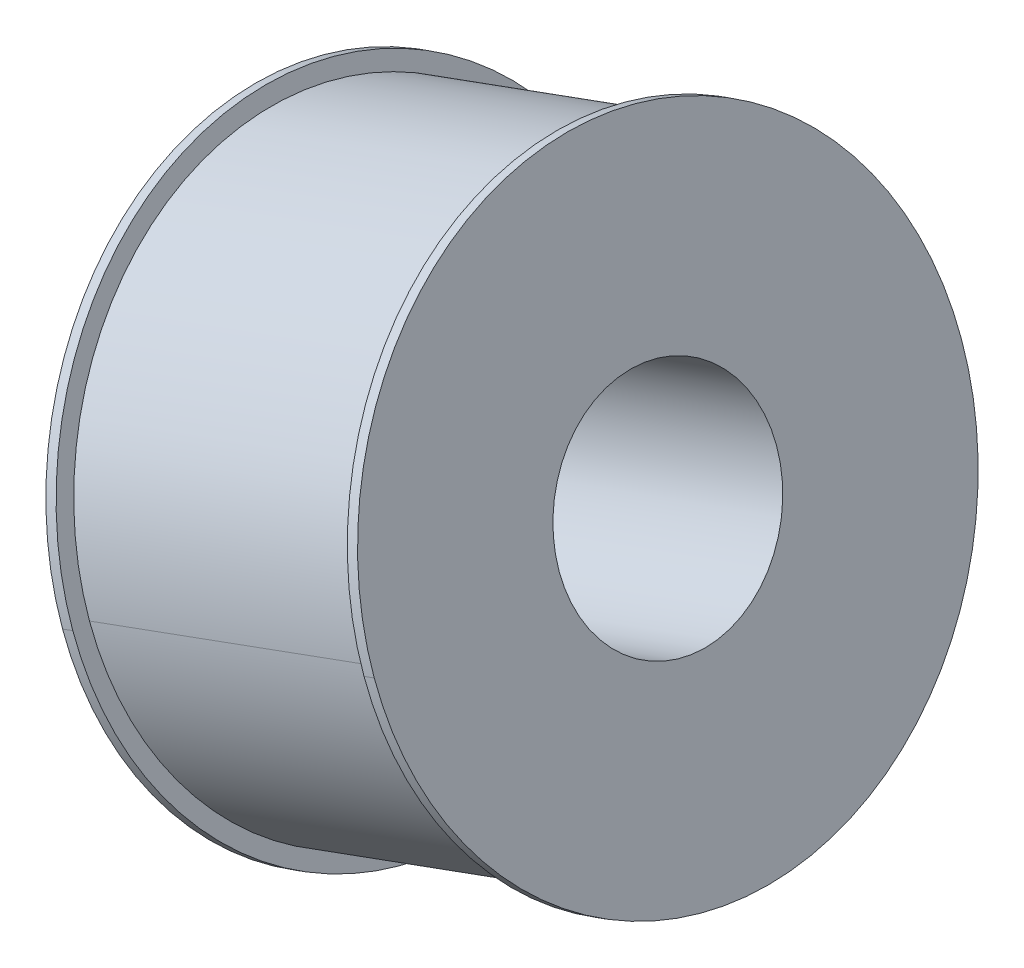
ISO-10303-21;
HEADER;
FILE_DESCRIPTION(('STEP AP214'),'2;1');
FILE_NAME('part.step','',(''),(''),'','','');
FILE_SCHEMA(('AUTOMOTIVE_DESIGN { 1 0 10303 214 1 1 1 1 }'));
ENDSEC;
DATA;
#1=APPLICATION_CONTEXT('core data for automotive mechanical design processes');
#2=APPLICATION_PROTOCOL_DEFINITION('international standard','automotive_design',2000,#1);
#3=PRODUCT_CONTEXT('',#1,'mechanical');
#4=PRODUCT('Part','Part','',(#3));
#5=PRODUCT_RELATED_PRODUCT_CATEGORY('part','',(#4));
#6=PRODUCT_DEFINITION_FORMATION('','',#4);
#7=PRODUCT_DEFINITION_CONTEXT('part definition',#1,'design');
#8=PRODUCT_DEFINITION('design','',#6,#7);
#9=PRODUCT_DEFINITION_SHAPE('','',#8);
#10=(LENGTH_UNIT() NAMED_UNIT(*) SI_UNIT(.MILLI.,.METRE.));
#11=(NAMED_UNIT(*) PLANE_ANGLE_UNIT() SI_UNIT($,.RADIAN.));
#12=(NAMED_UNIT(*) SI_UNIT($,.STERADIAN.) SOLID_ANGLE_UNIT());
#13=UNCERTAINTY_MEASURE_WITH_UNIT(LENGTH_MEASURE(1.E-05),#10,'distance_accuracy_value','');
#14=(GEOMETRIC_REPRESENTATION_CONTEXT(3) GLOBAL_UNCERTAINTY_ASSIGNED_CONTEXT((#13)) GLOBAL_UNIT_ASSIGNED_CONTEXT((#10,
#11,#12)) REPRESENTATION_CONTEXT('',''));
#15=CARTESIAN_POINT('',(0.,0.,0.));
#16=DIRECTION('',(0.,0.,1.));
#17=DIRECTION('',(1.,0.,0.));
#18=AXIS2_PLACEMENT_3D('',#15,#16,#17);
#19=CARTESIAN_POINT('',(53.8252917617742,-3.46148737991286,406.59864258433));
#20=DIRECTION('',(-0.93969262078591,-0.342020143325663,0.));
#21=DIRECTION('',(0.,0.,-1.));
#22=AXIS2_PLACEMENT_3D('',#19,#20,#21);
#23=CYLINDRICAL_SURFACE('',#22,27.);
#24=CARTESIAN_POINT('',(53.8252917617742,-3.46148737991286,406.59864258433));
#25=DIRECTION('',(-0.93969262078591,-0.342020143325663,0.));
#26=DIRECTION('',(0.,0.,-1.));
#27=AXIS2_PLACEMENT_3D('',#24,#25,#26);
#28=CIRCLE('',#27,27.);
#29=CARTESIAN_POINT('',(53.8252917617742,-3.46148737991286,379.59864258433));
#30=VERTEX_POINT('',#29);
#31=CARTESIAN_POINT('',(53.8252917617742,-3.46148737991287,433.59864258433));
#32=VERTEX_POINT('',#31);
#33=EDGE_CURVE('E11',#30,#32,#28,.T.);
#34=ORIENTED_EDGE('',*,*,#33,.T.);
#35=DIRECTION('',(-0.93969262078591,-0.342020143325663,0.));
#36=VECTOR('',#35,1.);
#37=CARTESIAN_POINT('',(53.8252917617742,-3.46148737991287,433.59864258433));
#38=LINE('',#37,#36);
#39=CARTESIAN_POINT('',(52.8855991409883,-3.80350752323853,433.59864258433));
#40=VERTEX_POINT('',#39);
#41=EDGE_CURVE('E60',#32,#40,#38,.T.);
#42=ORIENTED_EDGE('',*,*,#41,.T.);
#43=CARTESIAN_POINT('',(52.8855991409883,-3.80350752323853,406.59864258433));
#44=DIRECTION('',(-0.93969262078591,-0.342020143325663,0.));
#45=DIRECTION('',(0.,0.,-1.));
#46=AXIS2_PLACEMENT_3D('',#43,#44,#45);
#47=CIRCLE('',#46,27.);
#48=CARTESIAN_POINT('',(52.8855991409883,-3.80350752323853,379.59864258433));
#49=VERTEX_POINT('',#48);
#50=EDGE_CURVE('E174',#49,#40,#47,.T.);
#51=ORIENTED_EDGE('',*,*,#50,.F.);
#52=DIRECTION('',(-0.93969262078591,-0.342020143325663,0.));
#53=VECTOR('',#52,1.);
#54=CARTESIAN_POINT('',(53.8252917617742,-3.46148737991286,379.59864258433));
#55=LINE('',#54,#53);
#56=EDGE_CURVE('E132',#30,#49,#55,.T.);
#57=ORIENTED_EDGE('',*,*,#56,.F.);
#58=EDGE_LOOP('',(#34,#42,#51,#57));
#59=FACE_BOUND('',#58,.T.);
#60=ADVANCED_FACE('F49',(#59),#23,.T.);
#61=CARTESIAN_POINT('',(80.6065314541727,6.28608670486854,406.59864258433));
#62=DIRECTION('',(0.93969262078591,0.342020143325663,0.));
#63=DIRECTION('',(0.,0.,1.));
#64=AXIS2_PLACEMENT_3D('',#61,#62,#63);
#65=CYLINDRICAL_SURFACE('',#64,27.);
#66=CARTESIAN_POINT('',(80.6065314541727,6.28608670486854,406.59864258433));
#67=DIRECTION('',(0.93969262078591,0.342020143325663,0.));
#68=DIRECTION('',(0.,0.,1.));
#69=AXIS2_PLACEMENT_3D('',#66,#67,#68);
#70=CIRCLE('',#69,27.);
#71=CARTESIAN_POINT('',(80.6065314541727,6.28608670486854,433.59864258433));
#72=VERTEX_POINT('',#71);
#73=CARTESIAN_POINT('',(80.6065314541727,6.28608670486853,379.59864258433));
#74=VERTEX_POINT('',#73);
#75=EDGE_CURVE('E167',#72,#74,#70,.T.);
#76=ORIENTED_EDGE('',*,*,#75,.T.);
#77=DIRECTION('',(0.93969262078591,0.342020143325663,0.));
#78=VECTOR('',#77,1.);
#79=CARTESIAN_POINT('',(80.6065314541727,6.28608670486853,379.59864258433));
#80=LINE('',#79,#78);
#81=CARTESIAN_POINT('',(81.5462240749586,6.6281068481942,379.59864258433));
#82=VERTEX_POINT('',#81);
#83=EDGE_CURVE('E163',#74,#82,#80,.T.);
#84=ORIENTED_EDGE('',*,*,#83,.T.);
#85=CARTESIAN_POINT('',(81.5462240749586,6.6281068481942,406.59864258433));
#86=DIRECTION('',(0.93969262078591,0.342020143325663,0.));
#87=DIRECTION('',(0.,0.,1.));
#88=AXIS2_PLACEMENT_3D('',#85,#86,#87);
#89=CIRCLE('',#88,27.);
#90=CARTESIAN_POINT('',(81.5462240749586,6.6281068481942,433.59864258433));
#91=VERTEX_POINT('',#90);
#92=EDGE_CURVE('E160',#91,#82,#89,.T.);
#93=ORIENTED_EDGE('',*,*,#92,.F.);
#94=DIRECTION('',(0.93969262078591,0.342020143325663,0.));
#95=VECTOR('',#94,1.);
#96=CARTESIAN_POINT('',(80.6065314541727,6.28608670486854,433.59864258433));
#97=LINE('',#96,#95);
#98=EDGE_CURVE('E195',#72,#91,#97,.T.);
#99=ORIENTED_EDGE('',*,*,#98,.F.);
#100=EDGE_LOOP('',(#76,#84,#93,#99));
#101=FACE_BOUND('',#100,.T.);
#102=ADVANCED_FACE('F213',(#101),#65,.T.);
#103=CARTESIAN_POINT('',(52.8855991409883,-3.80350752323853,406.59864258433));
#104=DIRECTION('',(-0.93969262078591,-0.342020143325663,0.));
#105=DIRECTION('',(0.,0.,-1.));
#106=AXIS2_PLACEMENT_3D('',#103,#104,#105);
#107=CYLINDRICAL_SURFACE('',#106,19.);
#108=CARTESIAN_POINT('',(52.8855991409883,-3.80350752323853,406.59864258433));
#109=DIRECTION('',(0.93969262078591,0.342020143325663,0.));
#110=DIRECTION('',(0.,0.,1.));
#111=AXIS2_PLACEMENT_3D('',#108,#109,#110);
#112=CIRCLE('',#111,19.);
#113=CARTESIAN_POINT('',(52.8855991409883,-3.80350752323853,425.59864258433));
#114=VERTEX_POINT('',#113);
#115=CARTESIAN_POINT('',(52.8855991409883,-3.80350752323853,387.59864258433));
#116=VERTEX_POINT('',#115);
#117=EDGE_CURVE('E189',#114,#116,#112,.T.);
#118=ORIENTED_EDGE('',*,*,#117,.F.);
#119=DIRECTION('',(-0.93969262078591,-0.342020143325663,0.));
#120=VECTOR('',#119,1.);
#121=CARTESIAN_POINT('',(52.8855991409883,-3.80350752323853,425.59864258433));
#122=LINE('',#121,#120);
#123=CARTESIAN_POINT('',(45.837904485094,-6.368658598181,425.59864258433));
#124=VERTEX_POINT('',#123);
#125=EDGE_CURVE('E168',#114,#124,#122,.T.);
#126=ORIENTED_EDGE('',*,*,#125,.T.);
#127=CARTESIAN_POINT('',(45.837904485094,-6.368658598181,406.59864258433));
#128=DIRECTION('',(0.93969262078591,0.342020143325663,0.));
#129=DIRECTION('',(0.,0.,1.));
#130=AXIS2_PLACEMENT_3D('',#127,#128,#129);
#131=CIRCLE('',#130,19.);
#132=CARTESIAN_POINT('',(45.837904485094,-6.368658598181,387.59864258433));
#133=VERTEX_POINT('',#132);
#134=EDGE_CURVE('E373',#124,#133,#131,.T.);
#135=ORIENTED_EDGE('',*,*,#134,.T.);
#136=DIRECTION('',(-0.93969262078591,-0.342020143325663,0.));
#137=VECTOR('',#136,1.);
#138=CARTESIAN_POINT('',(52.8855991409883,-3.80350752323853,387.59864258433));
#139=LINE('',#138,#137);
#140=EDGE_CURVE('E140',#116,#133,#139,.T.);
#141=ORIENTED_EDGE('',*,*,#140,.F.);
#142=EDGE_LOOP('',(#118,#126,#135,#141));
#143=FACE_BOUND('',#142,.T.);
#144=ADVANCED_FACE('F239',(#143),#107,.T.);
#145=CARTESIAN_POINT('',(81.5462240749586,6.6281068481942,406.59864258433));
#146=DIRECTION('',(-0.93969262078591,-0.342020143325663,0.));
#147=DIRECTION('',(0.,0.,-1.));
#148=AXIS2_PLACEMENT_3D('',#145,#146,#147);
#149=CYLINDRICAL_SURFACE('',#148,25.465);
#150=CARTESIAN_POINT('',(80.6065314541727,6.28608670486854,406.59864258433));
#151=DIRECTION('',(0.93969262078591,0.342020143325663,0.));
#152=DIRECTION('',(0.,0.,1.));
#153=AXIS2_PLACEMENT_3D('',#150,#151,#152);
#154=CIRCLE('',#153,25.465);
#155=CARTESIAN_POINT('',(80.6065314541727,6.28608670486853,432.06364258433));
#156=VERTEX_POINT('',#155);
#157=CARTESIAN_POINT('',(80.6065314541727,6.28608670486854,381.13364258433));
#158=VERTEX_POINT('',#157);
#159=EDGE_CURVE('E152',#156,#158,#154,.T.);
#160=ORIENTED_EDGE('',*,*,#159,.F.);
#161=DIRECTION('',(-0.93969262078591,-0.342020143325663,0.));
#162=VECTOR('',#161,1.);
#163=CARTESIAN_POINT('',(81.5462240749586,6.6281068481942,432.06364258433));
#164=LINE('',#163,#162);
#165=CARTESIAN_POINT('',(53.8252917617742,-3.46148737991287,432.06364258433));
#166=VERTEX_POINT('',#165);
#167=EDGE_CURVE('E127',#156,#166,#164,.T.);
#168=ORIENTED_EDGE('',*,*,#167,.T.);
#169=CARTESIAN_POINT('',(53.8252917617742,-3.46148737991286,406.59864258433));
#170=DIRECTION('',(-0.93969262078591,-0.342020143325663,0.));
#171=DIRECTION('',(0.,0.,-1.));
#172=AXIS2_PLACEMENT_3D('',#169,#170,#171);
#173=CIRCLE('',#172,25.465);
#174=CARTESIAN_POINT('',(53.8252917617742,-3.46148737991286,381.13364258433));
#175=VERTEX_POINT('',#174);
#176=EDGE_CURVE('E120',#175,#166,#173,.T.);
#177=ORIENTED_EDGE('',*,*,#176,.F.);
#178=DIRECTION('',(-0.93969262078591,-0.342020143325663,0.));
#179=VECTOR('',#178,1.);
#180=CARTESIAN_POINT('',(81.5462240749586,6.6281068481942,381.13364258433));
#181=LINE('',#180,#179);
#182=EDGE_CURVE('E124',#158,#175,#181,.T.);
#183=ORIENTED_EDGE('',*,*,#182,.F.);
#184=EDGE_LOOP('',(#160,#168,#177,#183));
#185=FACE_BOUND('',#184,.T.);
#186=ADVANCED_FACE('F123',(#185),#149,.T.);
#187=CARTESIAN_POINT('',(81.5462240749586,6.6281068481942,406.59864258433));
#188=DIRECTION('',(-0.93969262078591,-0.342020143325663,0.));
#189=DIRECTION('',(0.,0.,-1.));
#190=AXIS2_PLACEMENT_3D('',#187,#188,#189);
#191=CYLINDRICAL_SURFACE('',#190,25.465);
#192=ORIENTED_EDGE('',*,*,#167,.F.);
#193=CARTESIAN_POINT('',(80.6065314541727,6.28608670486854,406.59864258433));
#194=DIRECTION('',(0.93969262078591,0.342020143325663,0.));
#195=DIRECTION('',(0.,0.,1.));
#196=AXIS2_PLACEMENT_3D('',#193,#194,#195);
#197=CIRCLE('',#196,25.465);
#198=EDGE_CURVE('E138',#158,#156,#197,.T.);
#199=ORIENTED_EDGE('',*,*,#198,.F.);
#200=ORIENTED_EDGE('',*,*,#182,.T.);
#201=CARTESIAN_POINT('',(53.8252917617742,-3.46148737991286,406.59864258433));
#202=DIRECTION('',(-0.93969262078591,-0.342020143325663,0.));
#203=DIRECTION('',(0.,0.,-1.));
#204=AXIS2_PLACEMENT_3D('',#201,#202,#203);
#205=CIRCLE('',#204,25.465);
#206=EDGE_CURVE('E133',#166,#175,#205,.T.);
#207=ORIENTED_EDGE('',*,*,#206,.F.);
#208=EDGE_LOOP('',(#192,#199,#200,#207));
#209=FACE_BOUND('',#208,.T.);
#210=ADVANCED_FACE('F136',(#209),#191,.T.);
#211=CARTESIAN_POINT('',(45.837904485094,-6.368658598181,406.59864258433));
#212=DIRECTION('',(0.93969262078591,0.342020143325663,0.));
#213=DIRECTION('',(0.342020143325663,-0.93969262078591,0.));
#214=AXIS2_PLACEMENT_3D('',#211,#212,#213);
#215=PLANE('',#214);
#216=CARTESIAN_POINT('',(45.837904485094,-6.368658598181,406.59864258433));
#217=DIRECTION('',(0.93969262078591,0.342020143325663,0.));
#218=DIRECTION('',(0.,0.,1.));
#219=AXIS2_PLACEMENT_3D('',#216,#217,#218);
#220=CIRCLE('',#219,19.);
#221=EDGE_CURVE('E156',#133,#124,#220,.T.);
#222=ORIENTED_EDGE('',*,*,#221,.F.);
#223=ORIENTED_EDGE('',*,*,#134,.F.);
#224=EDGE_LOOP('',(#222,#223));
#225=FACE_BOUND('',#224,.T.);
#226=CARTESIAN_POINT('',(45.837904485094,-6.368658598181,406.59864258433));
#227=DIRECTION('',(-0.93969262078591,-0.342020143325663,0.));
#228=DIRECTION('',(0.342020143325663,-0.93969262078591,0.));
#229=AXIS2_PLACEMENT_3D('',#226,#227,#228);
#230=CIRCLE('',#229,9.99999999999998);
#231=CARTESIAN_POINT('',(49.2581059183506,-15.7655848060401,406.59864258433));
#232=VERTEX_POINT('',#231);
#233=EDGE_CURVE('E148',#232,#232,#230,.T.);
#234=ORIENTED_EDGE('',*,*,#233,.F.);
#235=EDGE_LOOP('',(#234));
#236=FACE_BOUND('',#235,.T.);
#237=ADVANCED_FACE('F244',(#225,#236),#215,.F.);
#238=CARTESIAN_POINT('',(52.8855991409883,-3.80350752323853,406.59864258433));
#239=DIRECTION('',(-0.93969262078591,-0.342020143325663,0.));
#240=DIRECTION('',(0.,0.,-1.));
#241=AXIS2_PLACEMENT_3D('',#238,#239,#240);
#242=CYLINDRICAL_SURFACE('',#241,19.);
#243=ORIENTED_EDGE('',*,*,#125,.F.);
#244=CARTESIAN_POINT('',(52.8855991409883,-3.80350752323853,406.59864258433));
#245=DIRECTION('',(0.93969262078591,0.342020143325663,0.));
#246=DIRECTION('',(0.,0.,1.));
#247=AXIS2_PLACEMENT_3D('',#244,#245,#246);
#248=CIRCLE('',#247,19.);
#249=EDGE_CURVE('E53',#116,#114,#248,.T.);
#250=ORIENTED_EDGE('',*,*,#249,.F.);
#251=ORIENTED_EDGE('',*,*,#140,.T.);
#252=ORIENTED_EDGE('',*,*,#221,.T.);
#253=EDGE_LOOP('',(#243,#250,#251,#252));
#254=FACE_BOUND('',#253,.T.);
#255=ADVANCED_FACE('F219',(#254),#242,.T.);
#256=CARTESIAN_POINT('',(81.5462240749586,6.6281068481942,406.59864258433));
#257=DIRECTION('',(0.93969262078591,0.342020143325663,0.));
#258=DIRECTION('',(0.342020143325663,-0.93969262078591,0.));
#259=AXIS2_PLACEMENT_3D('',#256,#257,#258);
#260=PLANE('',#259);
#261=ORIENTED_EDGE('',*,*,#92,.T.);
#262=CARTESIAN_POINT('',(81.5462240749586,6.6281068481942,406.59864258433));
#263=DIRECTION('',(0.93969262078591,0.342020143325663,0.));
#264=DIRECTION('',(0.,0.,1.));
#265=AXIS2_PLACEMENT_3D('',#262,#263,#264);
#266=CIRCLE('',#265,27.);
#267=EDGE_CURVE('E171',#82,#91,#266,.T.);
#268=ORIENTED_EDGE('',*,*,#267,.T.);
#269=EDGE_LOOP('',(#261,#268));
#270=FACE_BOUND('',#269,.T.);
#271=CARTESIAN_POINT('',(81.5462240749586,6.6281068481942,406.59864258433));
#272=DIRECTION('',(0.93969262078591,0.342020143325663,0.));
#273=DIRECTION('',(-0.342020143325663,0.93969262078591,0.));
#274=AXIS2_PLACEMENT_3D('',#271,#272,#273);
#275=CIRCLE('',#274,9.99999999999998);
#276=CARTESIAN_POINT('',(78.126022641702,16.0250330560533,406.59864258433));
#277=VERTEX_POINT('',#276);
#278=EDGE_CURVE('E143',#277,#277,#275,.F.);
#279=ORIENTED_EDGE('',*,*,#278,.T.);
#280=EDGE_LOOP('',(#279));
#281=FACE_BOUND('',#280,.T.);
#282=ADVANCED_FACE('F215',(#270,#281),#260,.T.);
#283=CARTESIAN_POINT('',(52.8855991409883,-3.80350752323853,406.59864258433));
#284=DIRECTION('',(0.93969262078591,0.342020143325663,0.));
#285=DIRECTION('',(0.342020143325663,-0.93969262078591,0.));
#286=AXIS2_PLACEMENT_3D('',#283,#284,#285);
#287=PLANE('',#286);
#288=ORIENTED_EDGE('',*,*,#50,.T.);
#289=CARTESIAN_POINT('',(52.8855991409883,-3.80350752323853,406.59864258433));
#290=DIRECTION('',(-0.93969262078591,-0.342020143325663,0.));
#291=DIRECTION('',(0.,0.,-1.));
#292=AXIS2_PLACEMENT_3D('',#289,#290,#291);
#293=CIRCLE('',#292,27.);
#294=EDGE_CURVE('E179',#40,#49,#293,.T.);
#295=ORIENTED_EDGE('',*,*,#294,.T.);
#296=EDGE_LOOP('',(#288,#295));
#297=FACE_BOUND('',#296,.T.);
#298=ORIENTED_EDGE('',*,*,#249,.T.);
#299=ORIENTED_EDGE('',*,*,#117,.T.);
#300=EDGE_LOOP('',(#298,#299));
#301=FACE_BOUND('',#300,.T.);
#302=ADVANCED_FACE('F218',(#297,#301),#287,.F.);
#303=CARTESIAN_POINT('',(80.6065314541727,6.28608670486854,406.59864258433));
#304=DIRECTION('',(0.93969262078591,0.342020143325663,0.));
#305=DIRECTION('',(0.,0.,1.));
#306=AXIS2_PLACEMENT_3D('',#303,#304,#305);
#307=CYLINDRICAL_SURFACE('',#306,27.);
#308=ORIENTED_EDGE('',*,*,#83,.F.);
#309=CARTESIAN_POINT('',(80.6065314541727,6.28608670486854,406.59864258433));
#310=DIRECTION('',(0.93969262078591,0.342020143325663,0.));
#311=DIRECTION('',(0.,0.,1.));
#312=AXIS2_PLACEMENT_3D('',#309,#310,#311);
#313=CIRCLE('',#312,27.);
#314=EDGE_CURVE('E196',#74,#72,#313,.T.);
#315=ORIENTED_EDGE('',*,*,#314,.T.);
#316=ORIENTED_EDGE('',*,*,#98,.T.);
#317=ORIENTED_EDGE('',*,*,#267,.F.);
#318=EDGE_LOOP('',(#308,#315,#316,#317));
#319=FACE_BOUND('',#318,.T.);
#320=ADVANCED_FACE('F208',(#319),#307,.T.);
#321=CARTESIAN_POINT('',(80.6065314541727,6.28608670486854,406.59864258433));
#322=DIRECTION('',(0.93969262078591,0.342020143325663,0.));
#323=DIRECTION('',(0.342020143325663,-0.93969262078591,0.));
#324=AXIS2_PLACEMENT_3D('',#321,#322,#323);
#325=PLANE('',#324);
#326=ORIENTED_EDGE('',*,*,#75,.F.);
#327=ORIENTED_EDGE('',*,*,#314,.F.);
#328=EDGE_LOOP('',(#326,#327));
#329=FACE_BOUND('',#328,.T.);
#330=ORIENTED_EDGE('',*,*,#198,.T.);
#331=ORIENTED_EDGE('',*,*,#159,.T.);
#332=EDGE_LOOP('',(#330,#331));
#333=FACE_BOUND('',#332,.T.);
#334=ADVANCED_FACE('F246',(#329,#333),#325,.F.);
#335=CARTESIAN_POINT('',(53.8252917617742,-3.46148737991286,406.59864258433));
#336=DIRECTION('',(-0.93969262078591,-0.342020143325663,0.));
#337=DIRECTION('',(0.,0.,-1.));
#338=AXIS2_PLACEMENT_3D('',#335,#336,#337);
#339=CYLINDRICAL_SURFACE('',#338,27.);
#340=ORIENTED_EDGE('',*,*,#41,.F.);
#341=CARTESIAN_POINT('',(53.8252917617742,-3.46148737991286,406.59864258433));
#342=DIRECTION('',(-0.93969262078591,-0.342020143325663,0.));
#343=DIRECTION('',(0.,0.,-1.));
#344=AXIS2_PLACEMENT_3D('',#341,#342,#343);
#345=CIRCLE('',#344,27.);
#346=EDGE_CURVE('E155',#32,#30,#345,.T.);
#347=ORIENTED_EDGE('',*,*,#346,.T.);
#348=ORIENTED_EDGE('',*,*,#56,.T.);
#349=ORIENTED_EDGE('',*,*,#294,.F.);
#350=EDGE_LOOP('',(#340,#347,#348,#349));
#351=FACE_BOUND('',#350,.T.);
#352=ADVANCED_FACE('F230',(#351),#339,.T.);
#353=CARTESIAN_POINT('',(53.8252917617742,-3.46148737991286,406.59864258433));
#354=DIRECTION('',(-0.93969262078591,-0.342020143325663,0.));
#355=DIRECTION('',(0.,0.,-1.));
#356=AXIS2_PLACEMENT_3D('',#353,#354,#355);
#357=PLANE('',#356);
#358=ORIENTED_EDGE('',*,*,#33,.F.);
#359=ORIENTED_EDGE('',*,*,#346,.F.);
#360=EDGE_LOOP('',(#358,#359));
#361=FACE_BOUND('',#360,.T.);
#362=ORIENTED_EDGE('',*,*,#176,.T.);
#363=ORIENTED_EDGE('',*,*,#206,.T.);
#364=EDGE_LOOP('',(#362,#363));
#365=FACE_BOUND('',#364,.T.);
#366=ADVANCED_FACE('F51',(#361,#365),#357,.F.);
#367=CARTESIAN_POINT('',(121.414005538279,21.1387926070725,406.59864258433));
#368=DIRECTION('',(-0.93969262078591,-0.342020143325663,0.));
#369=DIRECTION('',(0.342020143325663,-0.93969262078591,0.));
#370=AXIS2_PLACEMENT_3D('',#367,#368,#369);
#371=CYLINDRICAL_SURFACE('',#370,9.99999999999998);
#372=ORIENTED_EDGE('',*,*,#233,.T.);
#373=EDGE_LOOP('',(#372));
#374=FACE_BOUND('',#373,.T.);
#375=ORIENTED_EDGE('',*,*,#278,.F.);
#376=EDGE_LOOP('',(#375));
#377=FACE_BOUND('',#376,.T.);
#378=ADVANCED_FACE('F223',(#374,#377),#371,.F.);
#379=CLOSED_SHELL('',(#60,#102,#144,#186,#210,#237,#255,#282,#302,#320,#334,#352,#366,#378));
#380=MANIFOLD_SOLID_BREP('B2',#379);
#381=ADVANCED_BREP_SHAPE_REPRESENTATION('',(#18,#380),#14);
#382=SHAPE_DEFINITION_REPRESENTATION(#9,#381);
ENDSEC;
END-ISO-10303-21;
